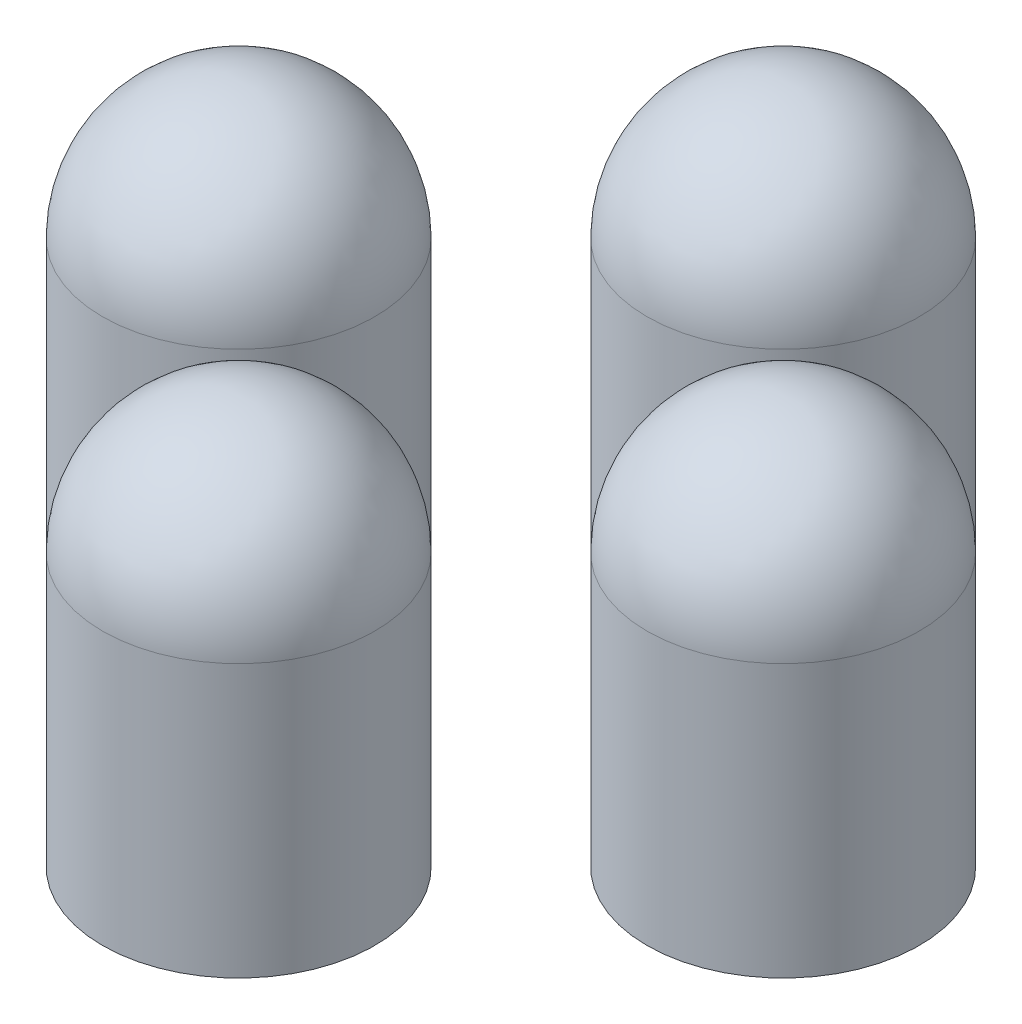
ISO-10303-21;
HEADER;
FILE_DESCRIPTION(('STEP AP214'),'2;1');
FILE_NAME('part.step','',(''),(''),'','','');
FILE_SCHEMA(('AUTOMOTIVE_DESIGN { 1 0 10303 214 1 1 1 1 }'));
ENDSEC;
DATA;
#1=APPLICATION_CONTEXT('core data for automotive mechanical design processes');
#2=APPLICATION_PROTOCOL_DEFINITION('international standard','automotive_design',2000,#1);
#3=PRODUCT_CONTEXT('',#1,'mechanical');
#4=PRODUCT('Part','Part','',(#3));
#5=PRODUCT_RELATED_PRODUCT_CATEGORY('part','',(#4));
#6=PRODUCT_DEFINITION_FORMATION('','',#4);
#7=PRODUCT_DEFINITION_CONTEXT('part definition',#1,'design');
#8=PRODUCT_DEFINITION('design','',#6,#7);
#9=PRODUCT_DEFINITION_SHAPE('','',#8);
#10=(LENGTH_UNIT() NAMED_UNIT(*) SI_UNIT(.MILLI.,.METRE.));
#11=(NAMED_UNIT(*) PLANE_ANGLE_UNIT() SI_UNIT($,.RADIAN.));
#12=(NAMED_UNIT(*) SI_UNIT($,.STERADIAN.) SOLID_ANGLE_UNIT());
#13=UNCERTAINTY_MEASURE_WITH_UNIT(LENGTH_MEASURE(1.E-05),#10,'distance_accuracy_value','');
#14=(GEOMETRIC_REPRESENTATION_CONTEXT(3) GLOBAL_UNCERTAINTY_ASSIGNED_CONTEXT((#13)) GLOBAL_UNIT_ASSIGNED_CONTEXT((#10,
#11,#12)) REPRESENTATION_CONTEXT('',''));
#15=CARTESIAN_POINT('',(0.,0.,0.));
#16=DIRECTION('',(0.,0.,1.));
#17=DIRECTION('',(1.,0.,0.));
#18=AXIS2_PLACEMENT_3D('',#15,#16,#17);
#19=CARTESIAN_POINT('',(9.9999999999999,10.,10.));
#20=DIRECTION('',(0.,-1.,0.));
#21=DIRECTION('',(0.,0.,-1.));
#22=AXIS2_PLACEMENT_3D('',#19,#20,#21);
#23=CYLINDRICAL_SURFACE('',#22,5.);
#24=CARTESIAN_POINT('',(9.9999999999999,10.,10.));
#25=DIRECTION('',(0.,1.,0.));
#26=DIRECTION('',(0.,0.,1.));
#27=AXIS2_PLACEMENT_3D('',#24,#25,#26);
#28=CIRCLE('',#27,5.);
#29=CARTESIAN_POINT('',(9.9999999999999,10.,15.));
#30=VERTEX_POINT('',#29);
#31=EDGE_CURVE('E11',#30,#30,#28,.T.);
#32=ORIENTED_EDGE('',*,*,#31,.F.);
#33=EDGE_LOOP('',(#32));
#34=FACE_BOUND('',#33,.T.);
#35=CARTESIAN_POINT('',(9.9999999999999,0.,10.));
#36=DIRECTION('',(0.,1.,0.));
#37=DIRECTION('',(0.,0.,1.));
#38=AXIS2_PLACEMENT_3D('',#35,#36,#37);
#39=CIRCLE('',#38,5.);
#40=CARTESIAN_POINT('',(9.9999999999999,0.,15.));
#41=VERTEX_POINT('',#40);
#42=EDGE_CURVE('E47',#41,#41,#39,.T.);
#43=ORIENTED_EDGE('',*,*,#42,.T.);
#44=EDGE_LOOP('',(#43));
#45=FACE_BOUND('',#44,.T.);
#46=ADVANCED_FACE('F40',(#34,#45),#23,.T.);
#47=CARTESIAN_POINT('',(9.9999999999999,10.,10.));
#48=DIRECTION('',(0.,0.,1.));
#49=DIRECTION('',(1.,0.,0.));
#50=AXIS2_PLACEMENT_3D('',#47,#48,#49);
#51=SPHERICAL_SURFACE('',#50,5.);
#52=CARTESIAN_POINT('',(9.9999999999999,10.,10.));
#53=DIRECTION('',(0.,1.,0.));
#54=DIRECTION('',(0.,0.,1.));
#55=AXIS2_PLACEMENT_3D('',#52,#53,#54);
#56=SPHERICAL_SURFACE('',#55,5.);
#57=ORIENTED_EDGE('',*,*,#31,.T.);
#58=EDGE_LOOP('',(#57));
#59=FACE_BOUND('',#58,.T.);
#60=ADVANCED_FACE('F42',(#59),#56,.T.);
#61=CARTESIAN_POINT('',(9.9999999999999,0.,10.));
#62=DIRECTION('',(0.,1.,0.));
#63=DIRECTION('',(0.,0.,1.));
#64=AXIS2_PLACEMENT_3D('',#61,#62,#63);
#65=PLANE('',#64);
#66=ORIENTED_EDGE('',*,*,#42,.F.);
#67=EDGE_LOOP('',(#66));
#68=FACE_BOUND('',#67,.T.);
#69=ADVANCED_FACE('F54',(#68),#65,.F.);
#70=CLOSED_SHELL('',(#46,#60,#69));
#71=MANIFOLD_SOLID_BREP('B2',#70);
#72=CARTESIAN_POINT('',(20.,10.,0.));
#73=DIRECTION('',(0.,-1.,0.));
#74=DIRECTION('',(0.,0.,-1.));
#75=AXIS2_PLACEMENT_3D('',#72,#73,#74);
#76=CYLINDRICAL_SURFACE('',#75,5.);
#77=CARTESIAN_POINT('',(20.,10.,0.));
#78=DIRECTION('',(0.,1.,0.));
#79=DIRECTION('',(0.,0.,1.));
#80=AXIS2_PLACEMENT_3D('',#77,#78,#79);
#81=CIRCLE('',#80,5.);
#82=CARTESIAN_POINT('',(20.,10.,5.00000000000007));
#83=VERTEX_POINT('',#82);
#84=EDGE_CURVE('E39',#83,#83,#81,.T.);
#85=ORIENTED_EDGE('',*,*,#84,.F.);
#86=EDGE_LOOP('',(#85));
#87=FACE_BOUND('',#86,.T.);
#88=CARTESIAN_POINT('',(20.,0.,0.));
#89=DIRECTION('',(0.,1.,0.));
#90=DIRECTION('',(0.,0.,1.));
#91=AXIS2_PLACEMENT_3D('',#88,#89,#90);
#92=CIRCLE('',#91,5.);
#93=CARTESIAN_POINT('',(20.,0.,5.00000000000007));
#94=VERTEX_POINT('',#93);
#95=EDGE_CURVE('E96',#94,#94,#92,.T.);
#96=ORIENTED_EDGE('',*,*,#95,.T.);
#97=EDGE_LOOP('',(#96));
#98=FACE_BOUND('',#97,.T.);
#99=ADVANCED_FACE('F89',(#87,#98),#76,.T.);
#100=CARTESIAN_POINT('',(20.,10.,0.));
#101=DIRECTION('',(0.,0.,1.));
#102=DIRECTION('',(1.,0.,0.));
#103=AXIS2_PLACEMENT_3D('',#100,#101,#102);
#104=SPHERICAL_SURFACE('',#103,5.);
#105=CARTESIAN_POINT('',(20.,10.,0.));
#106=DIRECTION('',(0.,1.,0.));
#107=DIRECTION('',(0.,0.,1.));
#108=AXIS2_PLACEMENT_3D('',#105,#106,#107);
#109=SPHERICAL_SURFACE('',#108,5.);
#110=ORIENTED_EDGE('',*,*,#84,.T.);
#111=EDGE_LOOP('',(#110));
#112=FACE_BOUND('',#111,.T.);
#113=ADVANCED_FACE('F91',(#112),#109,.T.);
#114=CARTESIAN_POINT('',(20.,0.,0.));
#115=DIRECTION('',(0.,1.,0.));
#116=DIRECTION('',(0.,0.,1.));
#117=AXIS2_PLACEMENT_3D('',#114,#115,#116);
#118=PLANE('',#117);
#119=ORIENTED_EDGE('',*,*,#95,.F.);
#120=EDGE_LOOP('',(#119));
#121=FACE_BOUND('',#120,.T.);
#122=ADVANCED_FACE('F103',(#121),#118,.F.);
#123=CLOSED_SHELL('',(#99,#113,#122));
#124=MANIFOLD_SOLID_BREP('B6',#123);
#125=CARTESIAN_POINT('',(10.,10.,-10.));
#126=DIRECTION('',(0.,-1.,0.));
#127=DIRECTION('',(0.,0.,-1.));
#128=AXIS2_PLACEMENT_3D('',#125,#126,#127);
#129=CYLINDRICAL_SURFACE('',#128,5.);
#130=CARTESIAN_POINT('',(10.,10.,-10.));
#131=DIRECTION('',(0.,1.,0.));
#132=DIRECTION('',(0.,0.,1.));
#133=AXIS2_PLACEMENT_3D('',#130,#131,#132);
#134=CIRCLE('',#133,5.);
#135=CARTESIAN_POINT('',(10.,10.,-5.));
#136=VERTEX_POINT('',#135);
#137=EDGE_CURVE('E88',#136,#136,#134,.T.);
#138=ORIENTED_EDGE('',*,*,#137,.F.);
#139=EDGE_LOOP('',(#138));
#140=FACE_BOUND('',#139,.T.);
#141=CARTESIAN_POINT('',(10.,0.,-10.));
#142=DIRECTION('',(0.,1.,0.));
#143=DIRECTION('',(0.,0.,1.));
#144=AXIS2_PLACEMENT_3D('',#141,#142,#143);
#145=CIRCLE('',#144,5.);
#146=CARTESIAN_POINT('',(10.,0.,-5.));
#147=VERTEX_POINT('',#146);
#148=EDGE_CURVE('E144',#147,#147,#145,.T.);
#149=ORIENTED_EDGE('',*,*,#148,.T.);
#150=EDGE_LOOP('',(#149));
#151=FACE_BOUND('',#150,.T.);
#152=ADVANCED_FACE('F137',(#140,#151),#129,.T.);
#153=CARTESIAN_POINT('',(10.,10.,-10.));
#154=DIRECTION('',(0.,0.,1.));
#155=DIRECTION('',(1.,0.,0.));
#156=AXIS2_PLACEMENT_3D('',#153,#154,#155);
#157=SPHERICAL_SURFACE('',#156,5.);
#158=CARTESIAN_POINT('',(10.,10.,-10.));
#159=DIRECTION('',(0.,1.,0.));
#160=DIRECTION('',(0.,0.,1.));
#161=AXIS2_PLACEMENT_3D('',#158,#159,#160);
#162=SPHERICAL_SURFACE('',#161,5.);
#163=ORIENTED_EDGE('',*,*,#137,.T.);
#164=EDGE_LOOP('',(#163));
#165=FACE_BOUND('',#164,.T.);
#166=ADVANCED_FACE('F139',(#165),#162,.T.);
#167=CARTESIAN_POINT('',(10.,0.,-10.));
#168=DIRECTION('',(0.,1.,0.));
#169=DIRECTION('',(0.,0.,1.));
#170=AXIS2_PLACEMENT_3D('',#167,#168,#169);
#171=PLANE('',#170);
#172=ORIENTED_EDGE('',*,*,#148,.F.);
#173=EDGE_LOOP('',(#172));
#174=FACE_BOUND('',#173,.T.);
#175=ADVANCED_FACE('F151',(#174),#171,.F.);
#176=CLOSED_SHELL('',(#152,#166,#175));
#177=MANIFOLD_SOLID_BREP('B34',#176);
#178=CARTESIAN_POINT('',(0.,10.,0.));
#179=DIRECTION('',(0.,-1.,0.));
#180=DIRECTION('',(0.,0.,-1.));
#181=AXIS2_PLACEMENT_3D('',#178,#179,#180);
#182=CYLINDRICAL_SURFACE('',#181,5.);
#183=CARTESIAN_POINT('',(0.,10.,0.));
#184=DIRECTION('',(0.,1.,0.));
#185=DIRECTION('',(0.,0.,1.));
#186=AXIS2_PLACEMENT_3D('',#183,#184,#185);
#187=CIRCLE('',#186,5.);
#188=CARTESIAN_POINT('',(0.,10.,5.));
#189=VERTEX_POINT('',#188);
#190=EDGE_CURVE('E136',#189,#189,#187,.T.);
#191=ORIENTED_EDGE('',*,*,#190,.F.);
#192=EDGE_LOOP('',(#191));
#193=FACE_BOUND('',#192,.T.);
#194=CARTESIAN_POINT('',(0.,0.,0.));
#195=DIRECTION('',(0.,1.,0.));
#196=DIRECTION('',(0.,0.,1.));
#197=AXIS2_PLACEMENT_3D('',#194,#195,#196);
#198=CIRCLE('',#197,5.);
#199=CARTESIAN_POINT('',(0.,0.,5.));
#200=VERTEX_POINT('',#199);
#201=EDGE_CURVE('E185',#200,#200,#198,.T.);
#202=ORIENTED_EDGE('',*,*,#201,.T.);
#203=EDGE_LOOP('',(#202));
#204=FACE_BOUND('',#203,.T.);
#205=ADVANCED_FACE('F178',(#193,#204),#182,.T.);
#206=CARTESIAN_POINT('',(0.,10.,0.));
#207=DIRECTION('',(0.,0.,1.));
#208=DIRECTION('',(1.,0.,0.));
#209=AXIS2_PLACEMENT_3D('',#206,#207,#208);
#210=SPHERICAL_SURFACE('',#209,5.);
#211=CARTESIAN_POINT('',(0.,10.,0.));
#212=DIRECTION('',(0.,1.,0.));
#213=DIRECTION('',(0.,0.,1.));
#214=AXIS2_PLACEMENT_3D('',#211,#212,#213);
#215=SPHERICAL_SURFACE('',#214,5.);
#216=ORIENTED_EDGE('',*,*,#190,.T.);
#217=EDGE_LOOP('',(#216));
#218=FACE_BOUND('',#217,.T.);
#219=ADVANCED_FACE('F180',(#218),#215,.T.);
#220=CARTESIAN_POINT('',(0.,0.,0.));
#221=DIRECTION('',(0.,1.,0.));
#222=DIRECTION('',(0.,0.,1.));
#223=AXIS2_PLACEMENT_3D('',#220,#221,#222);
#224=PLANE('',#223);
#225=ORIENTED_EDGE('',*,*,#201,.F.);
#226=EDGE_LOOP('',(#225));
#227=FACE_BOUND('',#226,.T.);
#228=ADVANCED_FACE('F192',(#227),#224,.F.);
#229=CLOSED_SHELL('',(#205,#219,#228));
#230=MANIFOLD_SOLID_BREP('B83',#229);
#231=ADVANCED_BREP_SHAPE_REPRESENTATION('',(#18,#71,#124,#177,#230),#14);
#232=SHAPE_DEFINITION_REPRESENTATION(#9,#231);
ENDSEC;
END-ISO-10303-21;
